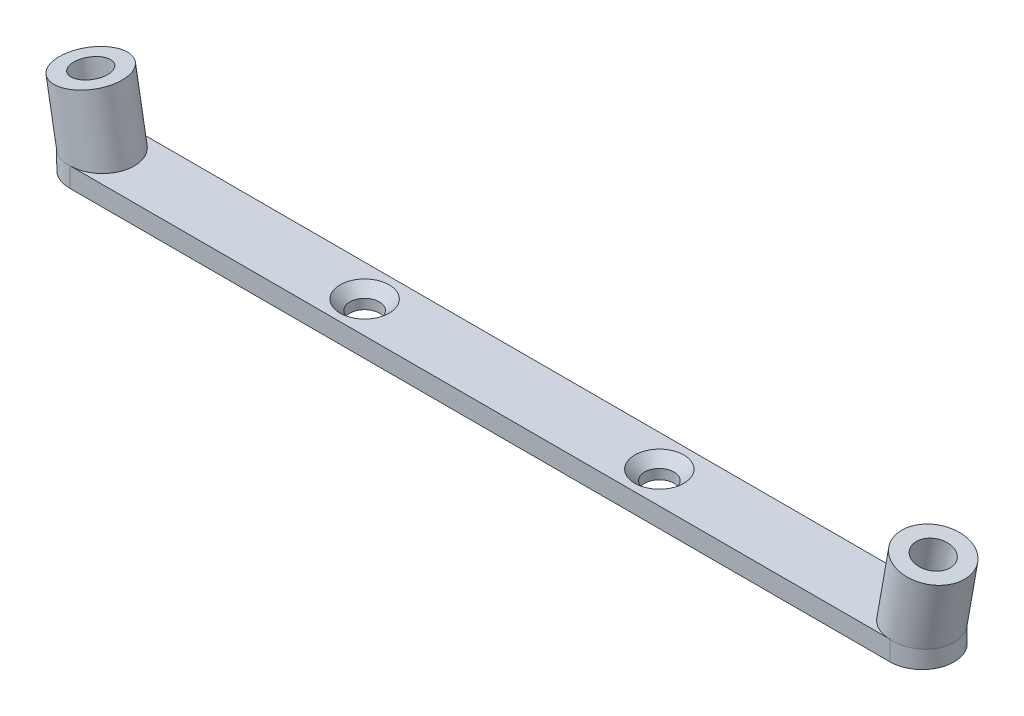
ISO-10303-21;
HEADER;
FILE_DESCRIPTION(('STEP AP214'),'2;1');
FILE_NAME('part.step','',(''),(''),'','','');
FILE_SCHEMA(('AUTOMOTIVE_DESIGN { 1 0 10303 214 1 1 1 1 }'));
ENDSEC;
DATA;
#1=APPLICATION_CONTEXT('core data for automotive mechanical design processes');
#2=APPLICATION_PROTOCOL_DEFINITION('international standard','automotive_design',2000,#1);
#3=PRODUCT_CONTEXT('',#1,'mechanical');
#4=PRODUCT('Part','Part','',(#3));
#5=PRODUCT_RELATED_PRODUCT_CATEGORY('part','',(#4));
#6=PRODUCT_DEFINITION_FORMATION('','',#4);
#7=PRODUCT_DEFINITION_CONTEXT('part definition',#1,'design');
#8=PRODUCT_DEFINITION('design','',#6,#7);
#9=PRODUCT_DEFINITION_SHAPE('','',#8);
#10=(LENGTH_UNIT() NAMED_UNIT(*) SI_UNIT(.MILLI.,.METRE.));
#11=(NAMED_UNIT(*) PLANE_ANGLE_UNIT() SI_UNIT($,.RADIAN.));
#12=(NAMED_UNIT(*) SI_UNIT($,.STERADIAN.) SOLID_ANGLE_UNIT());
#13=UNCERTAINTY_MEASURE_WITH_UNIT(LENGTH_MEASURE(1.E-05),#10,'distance_accuracy_value','');
#14=(GEOMETRIC_REPRESENTATION_CONTEXT(3) GLOBAL_UNCERTAINTY_ASSIGNED_CONTEXT((#13)) GLOBAL_UNIT_ASSIGNED_CONTEXT((#10,
#11,#12)) REPRESENTATION_CONTEXT('',''));
#15=CARTESIAN_POINT('',(0.,0.,0.));
#16=DIRECTION('',(0.,0.,1.));
#17=DIRECTION('',(1.,0.,0.));
#18=AXIS2_PLACEMENT_3D('',#15,#16,#17);
#19=CARTESIAN_POINT('',(41.75,92.2344169372197,0.));
#20=DIRECTION('',(0.,-1.,0.));
#21=DIRECTION('',(0.,0.,-1.));
#22=AXIS2_PLACEMENT_3D('',#19,#20,#21);
#23=CYLINDRICAL_SURFACE('',#22,3.25);
#24=CARTESIAN_POINT('',(41.75,1.99999999999984,0.));
#25=DIRECTION('',(-0.0871557427476584,-0.996194698091745,0.));
#26=DIRECTION('',(0.996194698091746,-0.0871557427476588,0.));
#27=AXIS2_PLACEMENT_3D('',#24,#25,#26);
#28=ELLIPSE('',#27,3.26241447201588,3.25);
#29=CARTESIAN_POINT('',(41.75,2.,3.25));
#30=VERTEX_POINT('',#29);
#31=CARTESIAN_POINT('',(41.75,2.,-3.25));
#32=VERTEX_POINT('',#31);
#33=EDGE_CURVE('E97',#30,#32,#28,.F.);
#34=ORIENTED_EDGE('',*,*,#33,.F.);
#35=DIRECTION('',(0.,-1.,0.));
#36=VECTOR('',#35,1.);
#37=CARTESIAN_POINT('',(41.75,92.2344169372197,3.25));
#38=LINE('',#37,#36);
#39=CARTESIAN_POINT('',(41.75,0.,3.25));
#40=VERTEX_POINT('',#39);
#41=EDGE_CURVE('E72',#30,#40,#38,.T.);
#42=ORIENTED_EDGE('',*,*,#41,.T.);
#43=CARTESIAN_POINT('',(41.75,0.,0.));
#44=DIRECTION('',(0.,1.,0.));
#45=DIRECTION('',(0.,0.,1.));
#46=AXIS2_PLACEMENT_3D('',#43,#44,#45);
#47=CIRCLE('',#46,3.25);
#48=CARTESIAN_POINT('',(41.75,0.,-3.25));
#49=VERTEX_POINT('',#48);
#50=EDGE_CURVE('E111',#40,#49,#47,.T.);
#51=ORIENTED_EDGE('',*,*,#50,.T.);
#52=DIRECTION('',(0.,-1.,0.));
#53=VECTOR('',#52,1.);
#54=CARTESIAN_POINT('',(41.75,92.2344169372197,-3.25));
#55=LINE('',#54,#53);
#56=EDGE_CURVE('E60',#32,#49,#55,.T.);
#57=ORIENTED_EDGE('',*,*,#56,.F.);
#58=EDGE_LOOP('',(#34,#42,#51,#57));
#59=FACE_BOUND('',#58,.T.);
#60=ADVANCED_FACE('F42',(#59),#23,.T.);
#61=CARTESIAN_POINT('',(-41.75,92.2344169372197,0.));
#62=DIRECTION('',(0.,-1.,0.));
#63=DIRECTION('',(0.,0.,-1.));
#64=AXIS2_PLACEMENT_3D('',#61,#62,#63);
#65=CYLINDRICAL_SURFACE('',#64,3.25);
#66=CARTESIAN_POINT('',(-41.75,2.00000000000029,0.));
#67=DIRECTION('',(0.0871557427476584,-0.996194698091746,0.));
#68=DIRECTION('',(-0.996194698091746,-0.0871557427476582,0.));
#69=AXIS2_PLACEMENT_3D('',#66,#67,#68);
#70=ELLIPSE('',#69,3.26241447201588,3.25);
#71=CARTESIAN_POINT('',(-41.75,2.,-3.25));
#72=VERTEX_POINT('',#71);
#73=CARTESIAN_POINT('',(-41.75,2.,3.25));
#74=VERTEX_POINT('',#73);
#75=EDGE_CURVE('E85',#72,#74,#70,.F.);
#76=ORIENTED_EDGE('',*,*,#75,.F.);
#77=DIRECTION('',(0.,-1.,0.));
#78=VECTOR('',#77,1.);
#79=CARTESIAN_POINT('',(-41.75,92.2344169372197,-3.25));
#80=LINE('',#79,#78);
#81=CARTESIAN_POINT('',(-41.75,0.,-3.25));
#82=VERTEX_POINT('',#81);
#83=EDGE_CURVE('E128',#72,#82,#80,.T.);
#84=ORIENTED_EDGE('',*,*,#83,.T.);
#85=CARTESIAN_POINT('',(-41.75,0.,0.));
#86=DIRECTION('',(0.,1.,0.));
#87=DIRECTION('',(0.,0.,1.));
#88=AXIS2_PLACEMENT_3D('',#85,#86,#87);
#89=CIRCLE('',#88,3.25);
#90=CARTESIAN_POINT('',(-41.75,0.,3.25));
#91=VERTEX_POINT('',#90);
#92=EDGE_CURVE('E123',#82,#91,#89,.T.);
#93=ORIENTED_EDGE('',*,*,#92,.T.);
#94=DIRECTION('',(0.,-1.,0.));
#95=VECTOR('',#94,1.);
#96=CARTESIAN_POINT('',(-41.75,92.2344169372197,3.25));
#97=LINE('',#96,#95);
#98=EDGE_CURVE('E79',#74,#91,#97,.T.);
#99=ORIENTED_EDGE('',*,*,#98,.F.);
#100=EDGE_LOOP('',(#76,#84,#93,#99));
#101=FACE_BOUND('',#100,.T.);
#102=ADVANCED_FACE('F182',(#101),#65,.T.);
#103=CARTESIAN_POINT('',(-41.75,92.2344169372197,3.25));
#104=DIRECTION('',(0.,0.,-1.));
#105=DIRECTION('',(-1.,0.,0.));
#106=AXIS2_PLACEMENT_3D('',#103,#104,#105);
#107=PLANE('',#106);
#108=DIRECTION('',(1.,0.,0.));
#109=VECTOR('',#108,1.);
#110=CARTESIAN_POINT('',(-41.75,2.,3.25));
#111=LINE('',#110,#109);
#112=EDGE_CURVE('E108',#74,#30,#111,.T.);
#113=ORIENTED_EDGE('',*,*,#112,.F.);
#114=ORIENTED_EDGE('',*,*,#98,.T.);
#115=DIRECTION('',(1.,0.,0.));
#116=VECTOR('',#115,1.);
#117=CARTESIAN_POINT('',(-41.75,0.,3.25));
#118=LINE('',#117,#116);
#119=EDGE_CURVE('E109',#91,#40,#118,.T.);
#120=ORIENTED_EDGE('',*,*,#119,.T.);
#121=ORIENTED_EDGE('',*,*,#41,.F.);
#122=EDGE_LOOP('',(#113,#114,#120,#121));
#123=FACE_BOUND('',#122,.T.);
#124=ADVANCED_FACE('F107',(#123),#107,.F.);
#125=CARTESIAN_POINT('',(-41.75,92.2344169372197,-3.25));
#126=DIRECTION('',(0.,0.,1.));
#127=DIRECTION('',(1.,0.,0.));
#128=AXIS2_PLACEMENT_3D('',#125,#126,#127);
#129=PLANE('',#128);
#130=DIRECTION('',(-1.,0.,0.));
#131=VECTOR('',#130,1.);
#132=CARTESIAN_POINT('',(-41.75,2.,-3.25));
#133=LINE('',#132,#131);
#134=EDGE_CURVE('E115',#32,#72,#133,.T.);
#135=ORIENTED_EDGE('',*,*,#134,.F.);
#136=ORIENTED_EDGE('',*,*,#56,.T.);
#137=DIRECTION('',(-1.,0.,0.));
#138=VECTOR('',#137,1.);
#139=CARTESIAN_POINT('',(-41.75,0.,-3.25));
#140=LINE('',#139,#138);
#141=EDGE_CURVE('E120',#49,#82,#140,.T.);
#142=ORIENTED_EDGE('',*,*,#141,.T.);
#143=ORIENTED_EDGE('',*,*,#83,.F.);
#144=EDGE_LOOP('',(#135,#136,#142,#143));
#145=FACE_BOUND('',#144,.T.);
#146=ADVANCED_FACE('F180',(#145),#129,.F.);
#147=CARTESIAN_POINT('',(-41.75,0.,0.));
#148=DIRECTION('',(0.,1.,0.));
#149=DIRECTION('',(0.,0.,1.));
#150=AXIS2_PLACEMENT_3D('',#147,#148,#149);
#151=PLANE('',#150);
#152=CARTESIAN_POINT('',(-15.,0.,0.));
#153=DIRECTION('',(0.,1.,0.));
#154=DIRECTION('',(0.,0.,1.));
#155=AXIS2_PLACEMENT_3D('',#152,#153,#154);
#156=CIRCLE('',#155,1.5);
#157=CARTESIAN_POINT('',(-15.,0.,1.5));
#158=VERTEX_POINT('',#157);
#159=EDGE_CURVE('E102',#158,#158,#156,.F.);
#160=ORIENTED_EDGE('',*,*,#159,.F.);
#161=EDGE_LOOP('',(#160));
#162=FACE_BOUND('',#161,.T.);
#163=CARTESIAN_POINT('',(15.,0.,0.));
#164=DIRECTION('',(0.,1.,0.));
#165=DIRECTION('',(0.,0.,1.));
#166=AXIS2_PLACEMENT_3D('',#163,#164,#165);
#167=CIRCLE('',#166,1.5);
#168=CARTESIAN_POINT('',(15.,0.,1.5));
#169=VERTEX_POINT('',#168);
#170=EDGE_CURVE('E155',#169,#169,#167,.F.);
#171=ORIENTED_EDGE('',*,*,#170,.F.);
#172=EDGE_LOOP('',(#171));
#173=FACE_BOUND('',#172,.T.);
#174=ORIENTED_EDGE('',*,*,#92,.F.);
#175=ORIENTED_EDGE('',*,*,#141,.F.);
#176=ORIENTED_EDGE('',*,*,#50,.F.);
#177=ORIENTED_EDGE('',*,*,#119,.F.);
#178=EDGE_LOOP('',(#174,#175,#176,#177));
#179=FACE_BOUND('',#178,.T.);
#180=ADVANCED_FACE('F177',(#162,#173,#179),#151,.F.);
#181=CARTESIAN_POINT('',(0.,2.,0.));
#182=DIRECTION('',(0.,1.,0.));
#183=DIRECTION('',(0.,0.,1.));
#184=AXIS2_PLACEMENT_3D('',#181,#182,#183);
#185=PLANE('',#184);
#186=CARTESIAN_POINT('',(15.,2.,0.));
#187=DIRECTION('',(0.,1.,0.));
#188=DIRECTION('',(0.,0.,1.));
#189=AXIS2_PLACEMENT_3D('',#186,#187,#188);
#190=CIRCLE('',#189,2.49999999999999);
#191=CARTESIAN_POINT('',(15.,2.,2.49999999999998));
#192=VERTEX_POINT('',#191);
#193=EDGE_CURVE('E52',#192,#192,#190,.F.);
#194=ORIENTED_EDGE('',*,*,#193,.T.);
#195=EDGE_LOOP('',(#194));
#196=FACE_BOUND('',#195,.T.);
#197=CARTESIAN_POINT('',(-15.,2.,0.));
#198=DIRECTION('',(0.,1.,0.));
#199=DIRECTION('',(0.,0.,1.));
#200=AXIS2_PLACEMENT_3D('',#197,#198,#199);
#201=CIRCLE('',#200,2.49999999999999);
#202=CARTESIAN_POINT('',(-15.,2.,2.49999999999999));
#203=VERTEX_POINT('',#202);
#204=EDGE_CURVE('E135',#203,#203,#201,.F.);
#205=ORIENTED_EDGE('',*,*,#204,.T.);
#206=EDGE_LOOP('',(#205));
#207=FACE_BOUND('',#206,.T.);
#208=ORIENTED_EDGE('',*,*,#112,.T.);
#209=CARTESIAN_POINT('',(41.75,2.,0.));
#210=DIRECTION('',(0.,1.,0.));
#211=DIRECTION('',(1.,0.,0.));
#212=AXIS2_PLACEMENT_3D('',#209,#210,#211);
#213=ELLIPSE('',#212,3.30013648862867,3.25);
#214=EDGE_CURVE('E95',#30,#32,#213,.F.);
#215=ORIENTED_EDGE('',*,*,#214,.T.);
#216=ORIENTED_EDGE('',*,*,#134,.T.);
#217=CARTESIAN_POINT('',(-41.75,2.,0.));
#218=DIRECTION('',(0.,1.,0.));
#219=DIRECTION('',(-1.,0.,0.));
#220=AXIS2_PLACEMENT_3D('',#217,#218,#219);
#221=ELLIPSE('',#220,3.30013648862867,3.25);
#222=EDGE_CURVE('E104',#72,#74,#221,.F.);
#223=ORIENTED_EDGE('',*,*,#222,.T.);
#224=EDGE_LOOP('',(#208,#215,#216,#223));
#225=FACE_BOUND('',#224,.T.);
#226=ADVANCED_FACE('F113',(#196,#207,#225),#185,.T.);
#227=CARTESIAN_POINT('',(-44.4749546064317,17.4539855187396,0.));
#228=DIRECTION('',(0.173648177666931,-0.984807753012208,0.));
#229=DIRECTION('',(0.984807753012208,0.173648177666931,0.));
#230=AXIS2_PLACEMENT_3D('',#227,#228,#229);
#231=CYLINDRICAL_SURFACE('',#230,3.25);
#232=CARTESIAN_POINT('',(-42.878713154835,8.40125039457935,0.));
#233=DIRECTION('',(-0.173648177666931,0.984807753012208,0.));
#234=DIRECTION('',(-0.984807753012208,-0.173648177666931,0.));
#235=AXIS2_PLACEMENT_3D('',#232,#233,#234);
#236=CIRCLE('',#235,3.25);
#237=CARTESIAN_POINT('',(-46.0793383521247,7.83689381716183,0.));
#238=VERTEX_POINT('',#237);
#239=EDGE_CURVE('E167',#238,#238,#236,.T.);
#240=ORIENTED_EDGE('',*,*,#239,.F.);
#241=EDGE_LOOP('',(#240));
#242=FACE_BOUND('',#241,.T.);
#243=ORIENTED_EDGE('',*,*,#222,.F.);
#244=ORIENTED_EDGE('',*,*,#75,.T.);
#245=EDGE_LOOP('',(#243,#244));
#246=FACE_BOUND('',#245,.T.);
#247=ADVANCED_FACE('F194',(#242,#246),#231,.T.);
#248=CARTESIAN_POINT('',(-44.4749546064317,17.4539855187396,0.));
#249=DIRECTION('',(0.173648177666931,-0.984807753012208,0.));
#250=DIRECTION('',(0.984807753012208,0.173648177666931,0.));
#251=AXIS2_PLACEMENT_3D('',#248,#249,#250);
#252=CYLINDRICAL_SURFACE('',#251,1.75);
#253=CARTESIAN_POINT('',(-41.75,2.,0.));
#254=DIRECTION('',(0.,1.,0.));
#255=DIRECTION('',(1.,0.,0.));
#256=AXIS2_PLACEMENT_3D('',#253,#254,#255);
#257=ELLIPSE('',#256,1.77699657080006,1.75);
#258=CARTESIAN_POINT('',(-39.9730034291999,2.,0.));
#259=VERTEX_POINT('',#258);
#260=EDGE_CURVE('E114',#259,#259,#257,.F.);
#261=ORIENTED_EDGE('',*,*,#260,.T.);
#262=EDGE_LOOP('',(#261));
#263=FACE_BOUND('',#262,.T.);
#264=CARTESIAN_POINT('',(-42.878713154835,8.40125039457935,0.));
#265=DIRECTION('',(-0.173648177666931,0.984807753012208,0.));
#266=DIRECTION('',(-0.984807753012208,-0.173648177666931,0.));
#267=AXIS2_PLACEMENT_3D('',#264,#265,#266);
#268=CIRCLE('',#267,1.75);
#269=CARTESIAN_POINT('',(-44.6021267226064,8.09736608366222,0.));
#270=VERTEX_POINT('',#269);
#271=EDGE_CURVE('E166',#270,#270,#268,.T.);
#272=ORIENTED_EDGE('',*,*,#271,.T.);
#273=EDGE_LOOP('',(#272));
#274=FACE_BOUND('',#273,.T.);
#275=ADVANCED_FACE('F204',(#263,#274),#252,.F.);
#276=CARTESIAN_POINT('',(-2.72964983925489,15.4806135072886,0.));
#277=DIRECTION('',(-0.173648177666931,0.984807753012208,0.));
#278=DIRECTION('',(-0.984807753012208,-0.173648177666931,0.));
#279=AXIS2_PLACEMENT_3D('',#276,#277,#278);
#280=PLANE('',#279);
#281=ORIENTED_EDGE('',*,*,#271,.F.);
#282=EDGE_LOOP('',(#281));
#283=FACE_BOUND('',#282,.T.);
#284=ORIENTED_EDGE('',*,*,#239,.T.);
#285=EDGE_LOOP('',(#284));
#286=FACE_BOUND('',#285,.T.);
#287=ADVANCED_FACE('F213',(#283,#286),#280,.T.);
#288=ORIENTED_EDGE('',*,*,#260,.F.);
#289=EDGE_LOOP('',(#288));
#290=FACE_BOUND('',#289,.T.);
#291=ADVANCED_FACE('F195',(#290),#185,.T.);
#292=CARTESIAN_POINT('',(44.4749546064317,17.4539855187396,0.));
#293=DIRECTION('',(-0.173648177666931,-0.984807753012208,0.));
#294=DIRECTION('',(0.984807753012208,-0.173648177666931,0.));
#295=AXIS2_PLACEMENT_3D('',#292,#293,#294);
#296=CYLINDRICAL_SURFACE('',#295,3.25);
#297=CARTESIAN_POINT('',(42.878713154835,8.40125039457935,0.));
#298=DIRECTION('',(0.173648177666931,0.984807753012208,0.));
#299=DIRECTION('',(-0.984807753012208,0.173648177666931,0.));
#300=AXIS2_PLACEMENT_3D('',#297,#298,#299);
#301=CIRCLE('',#300,3.25);
#302=CARTESIAN_POINT('',(39.6780879575454,8.96560697199688,0.));
#303=VERTEX_POINT('',#302);
#304=EDGE_CURVE('E105',#303,#303,#301,.T.);
#305=ORIENTED_EDGE('',*,*,#304,.F.);
#306=EDGE_LOOP('',(#305));
#307=FACE_BOUND('',#306,.T.);
#308=ORIENTED_EDGE('',*,*,#214,.F.);
#309=ORIENTED_EDGE('',*,*,#33,.T.);
#310=EDGE_LOOP('',(#308,#309));
#311=FACE_BOUND('',#310,.T.);
#312=ADVANCED_FACE('F96',(#307,#311),#296,.T.);
#313=CARTESIAN_POINT('',(44.4749546064317,17.4539855187396,0.));
#314=DIRECTION('',(-0.173648177666931,-0.984807753012208,0.));
#315=DIRECTION('',(0.984807753012208,-0.173648177666931,0.));
#316=AXIS2_PLACEMENT_3D('',#313,#314,#315);
#317=CYLINDRICAL_SURFACE('',#316,1.75);
#318=CARTESIAN_POINT('',(41.75,2.,0.));
#319=DIRECTION('',(0.,1.,0.));
#320=DIRECTION('',(-1.,0.,0.));
#321=AXIS2_PLACEMENT_3D('',#318,#319,#320);
#322=ELLIPSE('',#321,1.77699657080006,1.75);
#323=CARTESIAN_POINT('',(39.9730034291999,2.,0.));
#324=VERTEX_POINT('',#323);
#325=EDGE_CURVE('E118',#324,#324,#322,.F.);
#326=ORIENTED_EDGE('',*,*,#325,.T.);
#327=EDGE_LOOP('',(#326));
#328=FACE_BOUND('',#327,.T.);
#329=CARTESIAN_POINT('',(42.878713154835,8.40125039457935,0.));
#330=DIRECTION('',(0.173648177666931,0.984807753012208,0.));
#331=DIRECTION('',(-0.984807753012208,0.173648177666931,0.));
#332=AXIS2_PLACEMENT_3D('',#329,#330,#331);
#333=CIRCLE('',#332,1.75);
#334=CARTESIAN_POINT('',(41.1552995870637,8.70513470549648,0.));
#335=VERTEX_POINT('',#334);
#336=EDGE_CURVE('E101',#335,#335,#333,.T.);
#337=ORIENTED_EDGE('',*,*,#336,.T.);
#338=EDGE_LOOP('',(#337));
#339=FACE_BOUND('',#338,.T.);
#340=ADVANCED_FACE('F219',(#328,#339),#317,.F.);
#341=CARTESIAN_POINT('',(2.72964983925489,15.4806135072886,0.));
#342=DIRECTION('',(0.173648177666931,0.984807753012208,0.));
#343=DIRECTION('',(-0.984807753012208,0.173648177666931,0.));
#344=AXIS2_PLACEMENT_3D('',#341,#342,#343);
#345=PLANE('',#344);
#346=ORIENTED_EDGE('',*,*,#336,.F.);
#347=EDGE_LOOP('',(#346));
#348=FACE_BOUND('',#347,.T.);
#349=ORIENTED_EDGE('',*,*,#304,.T.);
#350=EDGE_LOOP('',(#349));
#351=FACE_BOUND('',#350,.T.);
#352=ADVANCED_FACE('F210',(#348,#351),#345,.T.);
#353=ORIENTED_EDGE('',*,*,#325,.F.);
#354=EDGE_LOOP('',(#353));
#355=FACE_BOUND('',#354,.T.);
#356=ADVANCED_FACE('F151',(#355),#185,.T.);
#357=CARTESIAN_POINT('',(15.,-4.24264068711929,0.));
#358=DIRECTION('',(0.,1.,0.));
#359=DIRECTION('',(0.,0.,1.));
#360=AXIS2_PLACEMENT_3D('',#357,#358,#359);
#361=CYLINDRICAL_SURFACE('',#360,1.5);
#362=CARTESIAN_POINT('',(15.,1.00000000000001,0.));
#363=DIRECTION('',(0.,1.,0.));
#364=DIRECTION('',(0.,0.,1.));
#365=AXIS2_PLACEMENT_3D('',#362,#363,#364);
#366=CIRCLE('',#365,1.5);
#367=CARTESIAN_POINT('',(15.,1.00000000000001,1.5));
#368=VERTEX_POINT('',#367);
#369=EDGE_CURVE('E132',#368,#368,#366,.T.);
#370=ORIENTED_EDGE('',*,*,#369,.T.);
#371=EDGE_LOOP('',(#370));
#372=FACE_BOUND('',#371,.T.);
#373=ORIENTED_EDGE('',*,*,#170,.T.);
#374=EDGE_LOOP('',(#373));
#375=FACE_BOUND('',#374,.T.);
#376=ADVANCED_FACE('F148',(#372,#375),#361,.F.);
#377=CARTESIAN_POINT('',(-15.,-4.24264068711929,0.));
#378=DIRECTION('',(0.,1.,0.));
#379=DIRECTION('',(0.,0.,1.));
#380=AXIS2_PLACEMENT_3D('',#377,#378,#379);
#381=CYLINDRICAL_SURFACE('',#380,1.5);
#382=CARTESIAN_POINT('',(-15.,1.00000000000001,0.));
#383=DIRECTION('',(0.,1.,0.));
#384=DIRECTION('',(0.,0.,1.));
#385=AXIS2_PLACEMENT_3D('',#382,#383,#384);
#386=CIRCLE('',#385,1.5);
#387=CARTESIAN_POINT('',(-15.,1.00000000000001,1.5));
#388=VERTEX_POINT('',#387);
#389=EDGE_CURVE('E11',#388,#388,#386,.T.);
#390=ORIENTED_EDGE('',*,*,#389,.T.);
#391=EDGE_LOOP('',(#390));
#392=FACE_BOUND('',#391,.T.);
#393=ORIENTED_EDGE('',*,*,#159,.T.);
#394=EDGE_LOOP('',(#393));
#395=FACE_BOUND('',#394,.T.);
#396=ADVANCED_FACE('F145',(#392,#395),#381,.F.);
#397=CARTESIAN_POINT('',(15.,1.00000000000001,0.));
#398=DIRECTION('',(0.,1.,0.));
#399=DIRECTION('',(0.,0.,1.));
#400=AXIS2_PLACEMENT_3D('',#397,#398,#399);
#401=CONICAL_SURFACE('',#400,1.5,0.785398163397446);
#402=ORIENTED_EDGE('',*,*,#193,.F.);
#403=EDGE_LOOP('',(#402));
#404=FACE_BOUND('',#403,.T.);
#405=ORIENTED_EDGE('',*,*,#369,.F.);
#406=EDGE_LOOP('',(#405));
#407=FACE_BOUND('',#406,.T.);
#408=ADVANCED_FACE('F142',(#404,#407),#401,.F.);
#409=CARTESIAN_POINT('',(-15.,1.00000000000001,0.));
#410=DIRECTION('',(0.,1.,0.));
#411=DIRECTION('',(0.,0.,1.));
#412=AXIS2_PLACEMENT_3D('',#409,#410,#411);
#413=CONICAL_SURFACE('',#412,1.5,0.785398163397446);
#414=ORIENTED_EDGE('',*,*,#204,.F.);
#415=EDGE_LOOP('',(#414));
#416=FACE_BOUND('',#415,.T.);
#417=ORIENTED_EDGE('',*,*,#389,.F.);
#418=EDGE_LOOP('',(#417));
#419=FACE_BOUND('',#418,.T.);
#420=ADVANCED_FACE('F45',(#416,#419),#413,.F.);
#421=CLOSED_SHELL('',(#60,#102,#124,#146,#180,#226,#247,#275,#287,#291,#312,#340,#352,#356,#376,
#396,#408,#420));
#422=MANIFOLD_SOLID_BREP('B2',#421);
#423=ADVANCED_BREP_SHAPE_REPRESENTATION('',(#18,#422),#14);
#424=SHAPE_DEFINITION_REPRESENTATION(#9,#423);
ENDSEC;
END-ISO-10303-21;
